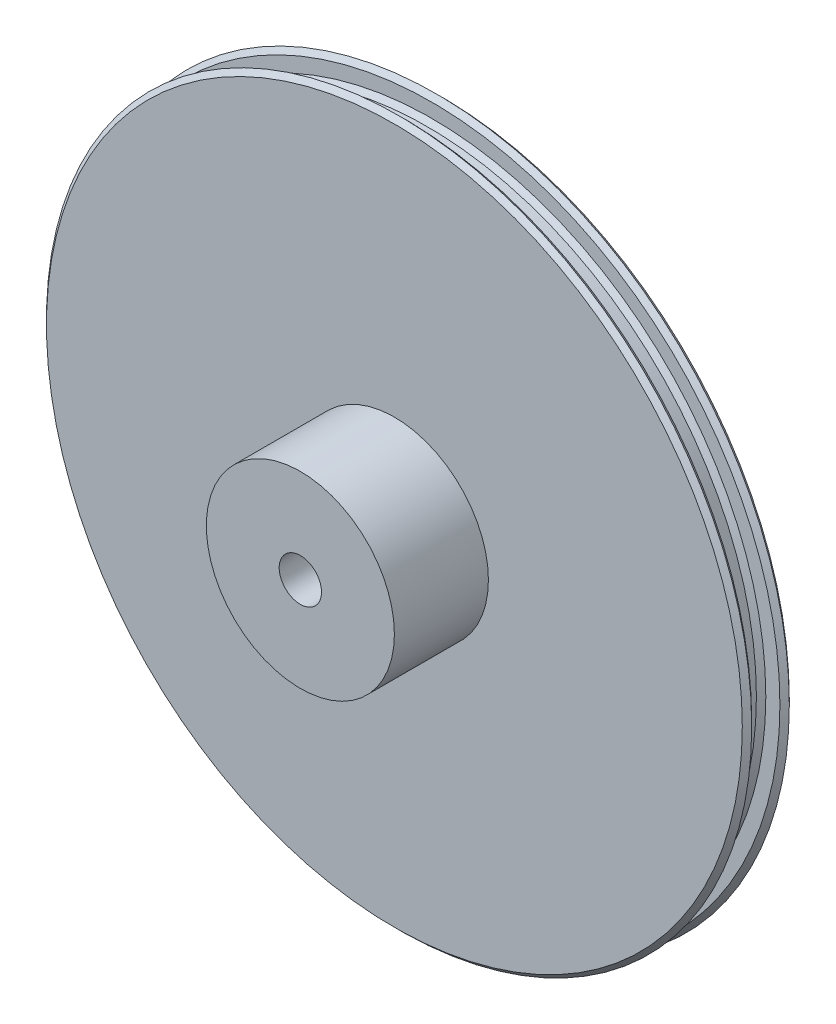
ISO-10303-21;
HEADER;
FILE_DESCRIPTION(('STEP AP214'),'2;1');
FILE_NAME('part.step','',(''),(''),'','','');
FILE_SCHEMA(('AUTOMOTIVE_DESIGN { 1 0 10303 214 1 1 1 1 }'));
ENDSEC;
DATA;
#1=APPLICATION_CONTEXT('core data for automotive mechanical design processes');
#2=APPLICATION_PROTOCOL_DEFINITION('international standard','automotive_design',2000,#1);
#3=PRODUCT_CONTEXT('',#1,'mechanical');
#4=PRODUCT('Part','Part','',(#3));
#5=PRODUCT_RELATED_PRODUCT_CATEGORY('part','',(#4));
#6=PRODUCT_DEFINITION_FORMATION('','',#4);
#7=PRODUCT_DEFINITION_CONTEXT('part definition',#1,'design');
#8=PRODUCT_DEFINITION('design','',#6,#7);
#9=PRODUCT_DEFINITION_SHAPE('','',#8);
#10=(LENGTH_UNIT() NAMED_UNIT(*) SI_UNIT(.MILLI.,.METRE.));
#11=(NAMED_UNIT(*) PLANE_ANGLE_UNIT() SI_UNIT($,.RADIAN.));
#12=(NAMED_UNIT(*) SI_UNIT($,.STERADIAN.) SOLID_ANGLE_UNIT());
#13=UNCERTAINTY_MEASURE_WITH_UNIT(LENGTH_MEASURE(1.E-05),#10,'distance_accuracy_value','');
#14=(GEOMETRIC_REPRESENTATION_CONTEXT(3) GLOBAL_UNCERTAINTY_ASSIGNED_CONTEXT((#13)) GLOBAL_UNIT_ASSIGNED_CONTEXT((#10,
#11,#12)) REPRESENTATION_CONTEXT('',''));
#15=CARTESIAN_POINT('',(0.,0.,0.));
#16=DIRECTION('',(0.,0.,1.));
#17=DIRECTION('',(1.,0.,0.));
#18=AXIS2_PLACEMENT_3D('',#15,#16,#17);
#19=CARTESIAN_POINT('',(0.,0.,0.));
#20=DIRECTION('',(0.,0.,1.));
#21=DIRECTION('',(1.,0.,0.));
#22=AXIS2_PLACEMENT_3D('',#19,#20,#21);
#23=CYLINDRICAL_SURFACE('',#22,4.5);
#24=CARTESIAN_POINT('',(0.,0.,30.));
#25=DIRECTION('',(0.,0.,1.));
#26=DIRECTION('',(1.,0.,0.));
#27=AXIS2_PLACEMENT_3D('',#24,#25,#26);
#28=CIRCLE('',#27,4.5);
#29=CARTESIAN_POINT('',(4.5,0.,30.));
#30=VERTEX_POINT('',#29);
#31=EDGE_CURVE('E123',#30,#30,#28,.T.);
#32=ORIENTED_EDGE('',*,*,#31,.T.);
#33=EDGE_LOOP('',(#32));
#34=FACE_BOUND('',#33,.T.);
#35=CARTESIAN_POINT('',(0.,0.,0.));
#36=DIRECTION('',(0.,0.,1.));
#37=DIRECTION('',(1.,0.,0.));
#38=AXIS2_PLACEMENT_3D('',#35,#36,#37);
#39=CIRCLE('',#38,4.5);
#40=CARTESIAN_POINT('',(4.5,0.,0.));
#41=VERTEX_POINT('',#40);
#42=EDGE_CURVE('E125',#41,#41,#39,.T.);
#43=ORIENTED_EDGE('',*,*,#42,.F.);
#44=EDGE_LOOP('',(#43));
#45=FACE_BOUND('',#44,.T.);
#46=CARTESIAN_POINT('',(0.,0.,5.));
#47=DIRECTION('',(0.,0.,1.));
#48=DIRECTION('',(1.,0.,0.));
#49=AXIS2_PLACEMENT_3D('',#46,#47,#48);
#50=CIRCLE('',#49,4.5);
#51=CARTESIAN_POINT('',(-1.5,4.24264068711928,5.));
#52=VERTEX_POINT('',#51);
#53=CARTESIAN_POINT('',(1.5,4.24264068711928,5.));
#54=VERTEX_POINT('',#53);
#55=EDGE_CURVE('E11',#52,#54,#50,.F.);
#56=ORIENTED_EDGE('',*,*,#55,.F.);
#57=DIRECTION('',(0.,0.,1.));
#58=VECTOR('',#57,1.);
#59=CARTESIAN_POINT('',(-1.5,4.24264068711928,0.));
#60=LINE('',#59,#58);
#61=CARTESIAN_POINT('',(-1.5,4.24264068711928,25.));
#62=VERTEX_POINT('',#61);
#63=EDGE_CURVE('E70',#52,#62,#60,.T.);
#64=ORIENTED_EDGE('',*,*,#63,.T.);
#65=CARTESIAN_POINT('',(0.,0.,25.));
#66=DIRECTION('',(0.,0.,1.));
#67=DIRECTION('',(1.,0.,0.));
#68=AXIS2_PLACEMENT_3D('',#65,#66,#67);
#69=CIRCLE('',#68,4.5);
#70=CARTESIAN_POINT('',(1.5,4.24264068711928,25.));
#71=VERTEX_POINT('',#70);
#72=EDGE_CURVE('E141',#62,#71,#69,.F.);
#73=ORIENTED_EDGE('',*,*,#72,.T.);
#74=DIRECTION('',(0.,0.,1.));
#75=VECTOR('',#74,1.);
#76=CARTESIAN_POINT('',(1.5,4.24264068711928,0.));
#77=LINE('',#76,#75);
#78=EDGE_CURVE('E55',#71,#54,#77,.F.);
#79=ORIENTED_EDGE('',*,*,#78,.T.);
#80=EDGE_LOOP('',(#56,#64,#73,#79));
#81=FACE_BOUND('',#80,.T.);
#82=ADVANCED_FACE('F45',(#34,#45,#81),#23,.F.);
#83=CARTESIAN_POINT('',(0.,0.,2.));
#84=DIRECTION('',(0.,0.,1.));
#85=DIRECTION('',(1.,0.,0.));
#86=AXIS2_PLACEMENT_3D('',#83,#84,#85);
#87=PLANE('',#86);
#88=CARTESIAN_POINT('',(0.,0.,2.));
#89=DIRECTION('',(0.,0.,1.));
#90=DIRECTION('',(1.,0.,0.));
#91=AXIS2_PLACEMENT_3D('',#88,#89,#90);
#92=CIRCLE('',#91,74.0000000000001);
#93=CARTESIAN_POINT('',(74.0000000000001,0.,2.));
#94=VERTEX_POINT('',#93);
#95=EDGE_CURVE('E152',#94,#94,#92,.T.);
#96=ORIENTED_EDGE('',*,*,#95,.T.);
#97=EDGE_LOOP('',(#96));
#98=FACE_BOUND('',#97,.T.);
#99=CARTESIAN_POINT('',(0.,0.,2.));
#100=DIRECTION('',(0.,0.,1.));
#101=DIRECTION('',(1.,0.,0.));
#102=AXIS2_PLACEMENT_3D('',#99,#100,#101);
#103=CIRCLE('',#102,71.);
#104=CARTESIAN_POINT('',(71.,0.,2.));
#105=VERTEX_POINT('',#104);
#106=EDGE_CURVE('E147',#105,#105,#103,.F.);
#107=ORIENTED_EDGE('',*,*,#106,.T.);
#108=EDGE_LOOP('',(#107));
#109=FACE_BOUND('',#108,.T.);
#110=ADVANCED_FACE('F202',(#98,#109),#87,.T.);
#111=CARTESIAN_POINT('',(0.,0.,0.));
#112=DIRECTION('',(0.,0.,1.));
#113=DIRECTION('',(1.,0.,0.));
#114=AXIS2_PLACEMENT_3D('',#111,#112,#113);
#115=PLANE('',#114);
#116=ORIENTED_EDGE('',*,*,#42,.T.);
#117=EDGE_LOOP('',(#116));
#118=FACE_BOUND('',#117,.T.);
#119=CARTESIAN_POINT('',(0.,0.,0.));
#120=DIRECTION('',(0.,0.,1.));
#121=DIRECTION('',(1.,0.,0.));
#122=AXIS2_PLACEMENT_3D('',#119,#120,#121);
#123=CIRCLE('',#122,74.);
#124=CARTESIAN_POINT('',(74.,0.,0.));
#125=VERTEX_POINT('',#124);
#126=EDGE_CURVE('E143',#125,#125,#123,.F.);
#127=ORIENTED_EDGE('',*,*,#126,.T.);
#128=EDGE_LOOP('',(#127));
#129=FACE_BOUND('',#128,.T.);
#130=ADVANCED_FACE('F208',(#118,#129),#115,.F.);
#131=CARTESIAN_POINT('',(0.,0.,8.));
#132=DIRECTION('',(0.,0.,-1.));
#133=DIRECTION('',(-1.,0.,0.));
#134=AXIS2_PLACEMENT_3D('',#131,#132,#133);
#135=CYLINDRICAL_SURFACE('',#134,70.);
#136=CARTESIAN_POINT('',(0.,0.,6.99999999999997));
#137=DIRECTION('',(0.,0.,1.));
#138=DIRECTION('',(1.,0.,0.));
#139=AXIS2_PLACEMENT_3D('',#136,#137,#138);
#140=CIRCLE('',#139,70.);
#141=CARTESIAN_POINT('',(70.,0.,6.99999999999997));
#142=VERTEX_POINT('',#141);
#143=EDGE_CURVE('E142',#142,#142,#140,.F.);
#144=ORIENTED_EDGE('',*,*,#143,.T.);
#145=EDGE_LOOP('',(#144));
#146=FACE_BOUND('',#145,.T.);
#147=CARTESIAN_POINT('',(0.,0.,2.99999999999996));
#148=DIRECTION('',(0.,0.,1.));
#149=DIRECTION('',(1.,0.,0.));
#150=AXIS2_PLACEMENT_3D('',#147,#148,#149);
#151=CIRCLE('',#150,70.);
#152=CARTESIAN_POINT('',(70.,0.,2.99999999999996));
#153=VERTEX_POINT('',#152);
#154=EDGE_CURVE('E156',#153,#153,#151,.T.);
#155=ORIENTED_EDGE('',*,*,#154,.T.);
#156=EDGE_LOOP('',(#155));
#157=FACE_BOUND('',#156,.T.);
#158=ADVANCED_FACE('F224',(#146,#157),#135,.T.);
#159=CARTESIAN_POINT('',(0.,0.,10.));
#160=DIRECTION('',(0.,0.,1.));
#161=DIRECTION('',(1.,0.,0.));
#162=AXIS2_PLACEMENT_3D('',#159,#160,#161);
#163=PLANE('',#162);
#164=CARTESIAN_POINT('',(0.,0.,10.));
#165=DIRECTION('',(0.,0.,1.));
#166=DIRECTION('',(1.,0.,0.));
#167=AXIS2_PLACEMENT_3D('',#164,#165,#166);
#168=CIRCLE('',#167,20.);
#169=CARTESIAN_POINT('',(20.,0.,10.));
#170=VERTEX_POINT('',#169);
#171=EDGE_CURVE('E137',#170,#170,#168,.T.);
#172=ORIENTED_EDGE('',*,*,#171,.F.);
#173=EDGE_LOOP('',(#172));
#174=FACE_BOUND('',#173,.T.);
#175=CARTESIAN_POINT('',(0.,0.,10.));
#176=DIRECTION('',(0.,0.,1.));
#177=DIRECTION('',(1.,0.,0.));
#178=AXIS2_PLACEMENT_3D('',#175,#176,#177);
#179=CIRCLE('',#178,74.);
#180=CARTESIAN_POINT('',(74.,0.,10.));
#181=VERTEX_POINT('',#180);
#182=EDGE_CURVE('E160',#181,#181,#179,.T.);
#183=ORIENTED_EDGE('',*,*,#182,.T.);
#184=EDGE_LOOP('',(#183));
#185=FACE_BOUND('',#184,.T.);
#186=ADVANCED_FACE('F220',(#174,#185),#163,.T.);
#187=CARTESIAN_POINT('',(0.,0.,8.));
#188=DIRECTION('',(0.,0.,1.));
#189=DIRECTION('',(1.,0.,0.));
#190=AXIS2_PLACEMENT_3D('',#187,#188,#189);
#191=PLANE('',#190);
#192=CARTESIAN_POINT('',(0.,0.,8.));
#193=DIRECTION('',(0.,0.,1.));
#194=DIRECTION('',(1.,0.,0.));
#195=AXIS2_PLACEMENT_3D('',#192,#193,#194);
#196=CIRCLE('',#195,74.);
#197=CARTESIAN_POINT('',(74.,0.,8.));
#198=VERTEX_POINT('',#197);
#199=EDGE_CURVE('E171',#198,#198,#196,.F.);
#200=ORIENTED_EDGE('',*,*,#199,.T.);
#201=EDGE_LOOP('',(#200));
#202=FACE_BOUND('',#201,.T.);
#203=CARTESIAN_POINT('',(0.,0.,8.));
#204=DIRECTION('',(0.,0.,1.));
#205=DIRECTION('',(1.,0.,0.));
#206=AXIS2_PLACEMENT_3D('',#203,#204,#205);
#207=CIRCLE('',#206,71.);
#208=CARTESIAN_POINT('',(71.,0.,8.));
#209=VERTEX_POINT('',#208);
#210=EDGE_CURVE('E167',#209,#209,#207,.T.);
#211=ORIENTED_EDGE('',*,*,#210,.T.);
#212=EDGE_LOOP('',(#211));
#213=FACE_BOUND('',#212,.T.);
#214=ADVANCED_FACE('F223',(#202,#213),#191,.F.);
#215=CARTESIAN_POINT('',(0.,0.,2.));
#216=DIRECTION('',(0.,0.,-1.));
#217=DIRECTION('',(-1.,0.,0.));
#218=AXIS2_PLACEMENT_3D('',#215,#216,#217);
#219=CONICAL_SURFACE('',#218,74.0000000000001,0.785398163397448);
#220=ORIENTED_EDGE('',*,*,#95,.F.);
#221=EDGE_LOOP('',(#220));
#222=FACE_BOUND('',#221,.T.);
#223=CARTESIAN_POINT('',(0.,0.,1.00000000000005));
#224=DIRECTION('',(0.,0.,1.));
#225=DIRECTION('',(1.,0.,0.));
#226=AXIS2_PLACEMENT_3D('',#223,#224,#225);
#227=CIRCLE('',#226,75.);
#228=CARTESIAN_POINT('',(75.,0.,1.00000000000005));
#229=VERTEX_POINT('',#228);
#230=EDGE_CURVE('E148',#229,#229,#227,.F.);
#231=ORIENTED_EDGE('',*,*,#230,.F.);
#232=EDGE_LOOP('',(#231));
#233=FACE_BOUND('',#232,.T.);
#234=ADVANCED_FACE('F228',(#222,#233),#219,.T.);
#235=CARTESIAN_POINT('',(0.,0.,1.00000000000003));
#236=DIRECTION('',(0.,0.,1.));
#237=DIRECTION('',(1.,0.,0.));
#238=AXIS2_PLACEMENT_3D('',#235,#236,#237);
#239=CONICAL_SURFACE('',#238,75.,0.785398163397448);
#240=ORIENTED_EDGE('',*,*,#126,.F.);
#241=EDGE_LOOP('',(#240));
#242=FACE_BOUND('',#241,.T.);
#243=ORIENTED_EDGE('',*,*,#230,.T.);
#244=EDGE_LOOP('',(#243));
#245=FACE_BOUND('',#244,.T.);
#246=ADVANCED_FACE('F237',(#242,#245),#239,.T.);
#247=CARTESIAN_POINT('',(0.,0.,2.99999999999996));
#248=DIRECTION('',(0.,0.,-1.));
#249=DIRECTION('',(-1.,0.,0.));
#250=AXIS2_PLACEMENT_3D('',#247,#248,#249);
#251=CONICAL_SURFACE('',#250,70.,0.785398163397448);
#252=ORIENTED_EDGE('',*,*,#106,.F.);
#253=EDGE_LOOP('',(#252));
#254=FACE_BOUND('',#253,.T.);
#255=ORIENTED_EDGE('',*,*,#154,.F.);
#256=EDGE_LOOP('',(#255));
#257=FACE_BOUND('',#256,.T.);
#258=ADVANCED_FACE('F244',(#254,#257),#251,.T.);
#259=CARTESIAN_POINT('',(0.,0.,9.00000000000001));
#260=DIRECTION('',(0.,0.,1.));
#261=DIRECTION('',(1.,0.,0.));
#262=AXIS2_PLACEMENT_3D('',#259,#260,#261);
#263=CONICAL_SURFACE('',#262,75.,0.785398163397448);
#264=ORIENTED_EDGE('',*,*,#199,.F.);
#265=EDGE_LOOP('',(#264));
#266=FACE_BOUND('',#265,.T.);
#267=CARTESIAN_POINT('',(0.,0.,9.00000000000001));
#268=DIRECTION('',(0.,0.,1.));
#269=DIRECTION('',(1.,0.,0.));
#270=AXIS2_PLACEMENT_3D('',#267,#268,#269);
#271=CIRCLE('',#270,75.);
#272=CARTESIAN_POINT('',(75.,0.,9.00000000000001));
#273=VERTEX_POINT('',#272);
#274=EDGE_CURVE('E136',#273,#273,#271,.T.);
#275=ORIENTED_EDGE('',*,*,#274,.F.);
#276=EDGE_LOOP('',(#275));
#277=FACE_BOUND('',#276,.T.);
#278=ADVANCED_FACE('F256',(#266,#277),#263,.T.);
#279=CARTESIAN_POINT('',(0.,0.,10.));
#280=DIRECTION('',(0.,0.,-1.));
#281=DIRECTION('',(-1.,0.,0.));
#282=AXIS2_PLACEMENT_3D('',#279,#280,#281);
#283=CONICAL_SURFACE('',#282,74.,0.785398163397448);
#284=ORIENTED_EDGE('',*,*,#274,.T.);
#285=EDGE_LOOP('',(#284));
#286=FACE_BOUND('',#285,.T.);
#287=ORIENTED_EDGE('',*,*,#182,.F.);
#288=EDGE_LOOP('',(#287));
#289=FACE_BOUND('',#288,.T.);
#290=ADVANCED_FACE('F259',(#286,#289),#283,.T.);
#291=CARTESIAN_POINT('',(0.,0.,8.));
#292=DIRECTION('',(0.,0.,1.));
#293=DIRECTION('',(1.,0.,0.));
#294=AXIS2_PLACEMENT_3D('',#291,#292,#293);
#295=CONICAL_SURFACE('',#294,71.,0.785398163397441);
#296=ORIENTED_EDGE('',*,*,#143,.F.);
#297=EDGE_LOOP('',(#296));
#298=FACE_BOUND('',#297,.T.);
#299=ORIENTED_EDGE('',*,*,#210,.F.);
#300=EDGE_LOOP('',(#299));
#301=FACE_BOUND('',#300,.T.);
#302=ADVANCED_FACE('F48',(#298,#301),#295,.T.);
#303=CARTESIAN_POINT('',(0.,0.,30.));
#304=DIRECTION('',(0.,0.,-1.));
#305=DIRECTION('',(-1.,0.,0.));
#306=AXIS2_PLACEMENT_3D('',#303,#304,#305);
#307=CYLINDRICAL_SURFACE('',#306,20.);
#308=CARTESIAN_POINT('',(0.,0.,30.));
#309=DIRECTION('',(0.,0.,1.));
#310=DIRECTION('',(1.,0.,0.));
#311=AXIS2_PLACEMENT_3D('',#308,#309,#310);
#312=CIRCLE('',#311,20.);
#313=CARTESIAN_POINT('',(20.,0.,30.));
#314=VERTEX_POINT('',#313);
#315=EDGE_CURVE('E129',#314,#314,#312,.T.);
#316=ORIENTED_EDGE('',*,*,#315,.F.);
#317=EDGE_LOOP('',(#316));
#318=FACE_BOUND('',#317,.T.);
#319=ORIENTED_EDGE('',*,*,#171,.T.);
#320=EDGE_LOOP('',(#319));
#321=FACE_BOUND('',#320,.T.);
#322=ADVANCED_FACE('F215',(#318,#321),#307,.T.);
#323=CARTESIAN_POINT('',(0.,0.,30.));
#324=DIRECTION('',(0.,0.,1.));
#325=DIRECTION('',(1.,0.,0.));
#326=AXIS2_PLACEMENT_3D('',#323,#324,#325);
#327=PLANE('',#326);
#328=ORIENTED_EDGE('',*,*,#31,.F.);
#329=EDGE_LOOP('',(#328));
#330=FACE_BOUND('',#329,.T.);
#331=ORIENTED_EDGE('',*,*,#315,.T.);
#332=EDGE_LOOP('',(#331));
#333=FACE_BOUND('',#332,.T.);
#334=ADVANCED_FACE('F197',(#330,#333),#327,.T.);
#335=CARTESIAN_POINT('',(1.5,7.5,5.));
#336=DIRECTION('',(1.,0.,0.));
#337=DIRECTION('',(0.,1.,0.));
#338=AXIS2_PLACEMENT_3D('',#335,#336,#337);
#339=PLANE('',#338);
#340=DIRECTION('',(0.,1.,0.));
#341=VECTOR('',#340,1.);
#342=CARTESIAN_POINT('',(1.5,7.5,25.));
#343=LINE('',#342,#341);
#344=CARTESIAN_POINT('',(1.5,7.5,25.));
#345=VERTEX_POINT('',#344);
#346=EDGE_CURVE('E62',#71,#345,#343,.T.);
#347=ORIENTED_EDGE('',*,*,#346,.T.);
#348=DIRECTION('',(0.,0.,1.));
#349=VECTOR('',#348,1.);
#350=CARTESIAN_POINT('',(1.5,7.5,5.));
#351=LINE('',#350,#349);
#352=CARTESIAN_POINT('',(1.5,7.5,5.));
#353=VERTEX_POINT('',#352);
#354=EDGE_CURVE('E101',#353,#345,#351,.T.);
#355=ORIENTED_EDGE('',*,*,#354,.F.);
#356=DIRECTION('',(0.,1.,0.));
#357=VECTOR('',#356,1.);
#358=CARTESIAN_POINT('',(1.5,7.5,5.));
#359=LINE('',#358,#357);
#360=EDGE_CURVE('E89',#54,#353,#359,.T.);
#361=ORIENTED_EDGE('',*,*,#360,.F.);
#362=ORIENTED_EDGE('',*,*,#78,.F.);
#363=EDGE_LOOP('',(#347,#355,#361,#362));
#364=FACE_BOUND('',#363,.T.);
#365=ADVANCED_FACE('F102',(#364),#339,.F.);
#366=CARTESIAN_POINT('',(-1.5,7.5,5.));
#367=DIRECTION('',(-1.,0.,0.));
#368=DIRECTION('',(0.,-1.,0.));
#369=AXIS2_PLACEMENT_3D('',#366,#367,#368);
#370=PLANE('',#369);
#371=DIRECTION('',(0.,-1.,0.));
#372=VECTOR('',#371,1.);
#373=CARTESIAN_POINT('',(-1.5,7.5,5.));
#374=LINE('',#373,#372);
#375=CARTESIAN_POINT('',(-1.5,7.5,5.));
#376=VERTEX_POINT('',#375);
#377=EDGE_CURVE('E107',#376,#52,#374,.T.);
#378=ORIENTED_EDGE('',*,*,#377,.F.);
#379=DIRECTION('',(0.,0.,1.));
#380=VECTOR('',#379,1.);
#381=CARTESIAN_POINT('',(-1.5,7.5,5.));
#382=LINE('',#381,#380);
#383=CARTESIAN_POINT('',(-1.5,7.5,25.));
#384=VERTEX_POINT('',#383);
#385=EDGE_CURVE('E106',#376,#384,#382,.T.);
#386=ORIENTED_EDGE('',*,*,#385,.T.);
#387=DIRECTION('',(0.,-1.,0.));
#388=VECTOR('',#387,1.);
#389=CARTESIAN_POINT('',(-1.5,7.5,25.));
#390=LINE('',#389,#388);
#391=EDGE_CURVE('E98',#384,#62,#390,.T.);
#392=ORIENTED_EDGE('',*,*,#391,.T.);
#393=ORIENTED_EDGE('',*,*,#63,.F.);
#394=EDGE_LOOP('',(#378,#386,#392,#393));
#395=FACE_BOUND('',#394,.T.);
#396=ADVANCED_FACE('F189',(#395),#370,.F.);
#397=CARTESIAN_POINT('',(0.,0.,5.));
#398=DIRECTION('',(0.,0.,1.));
#399=DIRECTION('',(1.,0.,0.));
#400=AXIS2_PLACEMENT_3D('',#397,#398,#399);
#401=PLANE('',#400);
#402=ORIENTED_EDGE('',*,*,#55,.T.);
#403=ORIENTED_EDGE('',*,*,#360,.T.);
#404=DIRECTION('',(-1.,0.,0.));
#405=VECTOR('',#404,1.);
#406=CARTESIAN_POINT('',(-1.5,7.5,5.));
#407=LINE('',#406,#405);
#408=EDGE_CURVE('E93',#353,#376,#407,.T.);
#409=ORIENTED_EDGE('',*,*,#408,.T.);
#410=ORIENTED_EDGE('',*,*,#377,.T.);
#411=EDGE_LOOP('',(#402,#403,#409,#410));
#412=FACE_BOUND('',#411,.T.);
#413=ADVANCED_FACE('F91',(#412),#401,.T.);
#414=CARTESIAN_POINT('',(0.,0.,25.));
#415=DIRECTION('',(0.,0.,1.));
#416=DIRECTION('',(1.,0.,0.));
#417=AXIS2_PLACEMENT_3D('',#414,#415,#416);
#418=PLANE('',#417);
#419=ORIENTED_EDGE('',*,*,#391,.F.);
#420=DIRECTION('',(-1.,0.,0.));
#421=VECTOR('',#420,1.);
#422=CARTESIAN_POINT('',(-1.5,7.5,25.));
#423=LINE('',#422,#421);
#424=EDGE_CURVE('E117',#345,#384,#423,.T.);
#425=ORIENTED_EDGE('',*,*,#424,.F.);
#426=ORIENTED_EDGE('',*,*,#346,.F.);
#427=ORIENTED_EDGE('',*,*,#72,.F.);
#428=EDGE_LOOP('',(#419,#425,#426,#427));
#429=FACE_BOUND('',#428,.T.);
#430=ADVANCED_FACE('F188',(#429),#418,.F.);
#431=CARTESIAN_POINT('',(-1.5,7.5,5.));
#432=DIRECTION('',(0.,1.,0.));
#433=DIRECTION('',(0.,0.,1.));
#434=AXIS2_PLACEMENT_3D('',#431,#432,#433);
#435=PLANE('',#434);
#436=ORIENTED_EDGE('',*,*,#424,.T.);
#437=ORIENTED_EDGE('',*,*,#385,.F.);
#438=ORIENTED_EDGE('',*,*,#408,.F.);
#439=ORIENTED_EDGE('',*,*,#354,.T.);
#440=EDGE_LOOP('',(#436,#437,#438,#439));
#441=FACE_BOUND('',#440,.T.);
#442=ADVANCED_FACE('F109',(#441),#435,.F.);
#443=CLOSED_SHELL('',(#82,#110,#130,#158,#186,#214,#234,#246,#258,#278,#290,#302,#322,#334,#365,
#396,#413,#430,#442));
#444=MANIFOLD_SOLID_BREP('B2',#443);
#445=ADVANCED_BREP_SHAPE_REPRESENTATION('',(#18,#444),#14);
#446=SHAPE_DEFINITION_REPRESENTATION(#9,#445);
ENDSEC;
END-ISO-10303-21;
